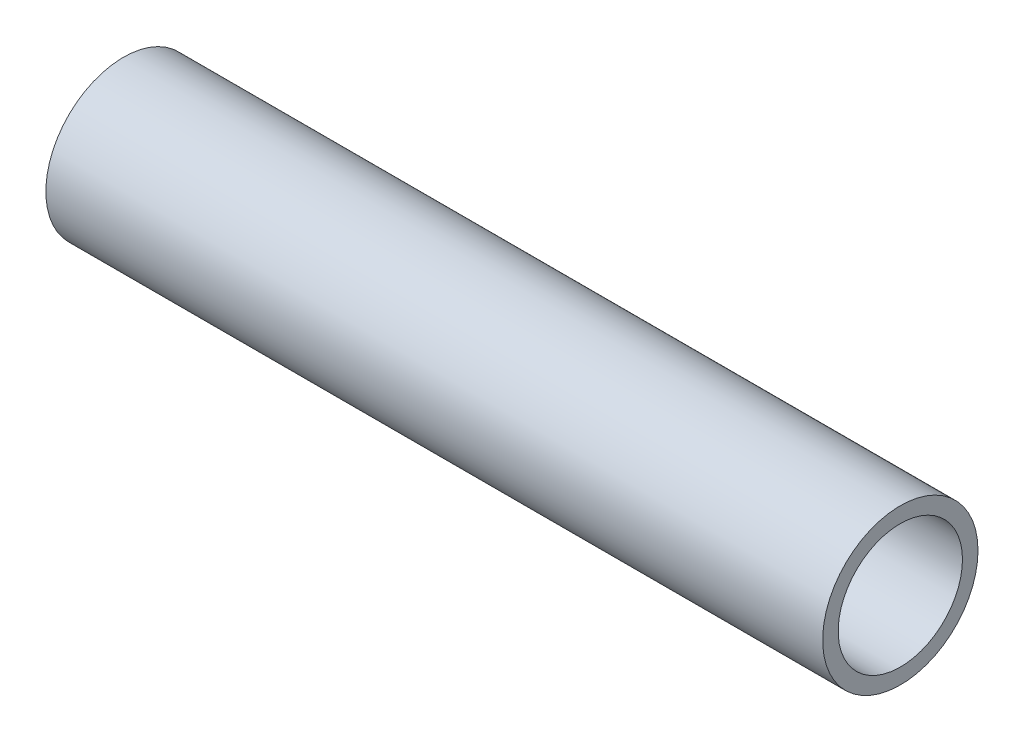
ISO-10303-21;
HEADER;
FILE_DESCRIPTION(('STEP AP214'),'2;1');
FILE_NAME('part.step','',(''),(''),'','','');
FILE_SCHEMA(('AUTOMOTIVE_DESIGN { 1 0 10303 214 1 1 1 1 }'));
ENDSEC;
DATA;
#1=APPLICATION_CONTEXT('core data for automotive mechanical design processes');
#2=APPLICATION_PROTOCOL_DEFINITION('international standard','automotive_design',2000,#1);
#3=PRODUCT_CONTEXT('',#1,'mechanical');
#4=PRODUCT('Part','Part','',(#3));
#5=PRODUCT_RELATED_PRODUCT_CATEGORY('part','',(#4));
#6=PRODUCT_DEFINITION_FORMATION('','',#4);
#7=PRODUCT_DEFINITION_CONTEXT('part definition',#1,'design');
#8=PRODUCT_DEFINITION('design','',#6,#7);
#9=PRODUCT_DEFINITION_SHAPE('','',#8);
#10=(LENGTH_UNIT() NAMED_UNIT(*) SI_UNIT(.MILLI.,.METRE.));
#11=(NAMED_UNIT(*) PLANE_ANGLE_UNIT() SI_UNIT($,.RADIAN.));
#12=(NAMED_UNIT(*) SI_UNIT($,.STERADIAN.) SOLID_ANGLE_UNIT());
#13=UNCERTAINTY_MEASURE_WITH_UNIT(LENGTH_MEASURE(1.E-05),#10,'distance_accuracy_value','');
#14=(GEOMETRIC_REPRESENTATION_CONTEXT(3) GLOBAL_UNCERTAINTY_ASSIGNED_CONTEXT((#13)) GLOBAL_UNIT_ASSIGNED_CONTEXT((#10,
#11,#12)) REPRESENTATION_CONTEXT('',''));
#15=CARTESIAN_POINT('',(0.,0.,0.));
#16=DIRECTION('',(0.,0.,1.));
#17=DIRECTION('',(1.,0.,0.));
#18=AXIS2_PLACEMENT_3D('',#15,#16,#17);
#19=CARTESIAN_POINT('',(25.,0.,0.));
#20=DIRECTION('',(1.,0.,0.));
#21=DIRECTION('',(0.,0.,-1.));
#22=AXIS2_PLACEMENT_3D('',#19,#20,#21);
#23=PLANE('',#22);
#24=CARTESIAN_POINT('',(25.,0.,0.));
#25=DIRECTION('',(1.,0.,0.));
#26=DIRECTION('',(0.,0.,-1.));
#27=AXIS2_PLACEMENT_3D('',#24,#25,#26);
#28=CIRCLE('',#27,5.);
#29=CARTESIAN_POINT('',(25.,0.,-5.));
#30=VERTEX_POINT('',#29);
#31=EDGE_CURVE('E10',#30,#30,#28,.T.);
#32=ORIENTED_EDGE('',*,*,#31,.T.);
#33=EDGE_LOOP('',(#32));
#34=FACE_BOUND('',#33,.T.);
#35=CARTESIAN_POINT('',(25.,0.,0.));
#36=DIRECTION('',(1.,0.,0.));
#37=DIRECTION('',(0.,0.,-1.));
#38=AXIS2_PLACEMENT_3D('',#35,#36,#37);
#39=CIRCLE('',#38,4.);
#40=CARTESIAN_POINT('',(25.,0.,-4.));
#41=VERTEX_POINT('',#40);
#42=EDGE_CURVE('E44',#41,#41,#39,.T.);
#43=ORIENTED_EDGE('',*,*,#42,.F.);
#44=EDGE_LOOP('',(#43));
#45=FACE_BOUND('',#44,.T.);
#46=ADVANCED_FACE('F33',(#34,#45),#23,.T.);
#47=CARTESIAN_POINT('',(-25.,0.,0.));
#48=DIRECTION('',(1.,0.,0.));
#49=DIRECTION('',(0.,0.,-1.));
#50=AXIS2_PLACEMENT_3D('',#47,#48,#49);
#51=PLANE('',#50);
#52=CARTESIAN_POINT('',(-25.,0.,0.));
#53=DIRECTION('',(1.,0.,0.));
#54=DIRECTION('',(0.,0.,-1.));
#55=AXIS2_PLACEMENT_3D('',#52,#53,#54);
#56=CIRCLE('',#55,5.);
#57=CARTESIAN_POINT('',(-25.,0.,-5.));
#58=VERTEX_POINT('',#57);
#59=EDGE_CURVE('E37',#58,#58,#56,.T.);
#60=ORIENTED_EDGE('',*,*,#59,.F.);
#61=EDGE_LOOP('',(#60));
#62=FACE_BOUND('',#61,.T.);
#63=CARTESIAN_POINT('',(-25.,0.,0.));
#64=DIRECTION('',(1.,0.,0.));
#65=DIRECTION('',(0.,0.,-1.));
#66=AXIS2_PLACEMENT_3D('',#63,#64,#65);
#67=CIRCLE('',#66,4.);
#68=CARTESIAN_POINT('',(-25.,0.,-4.));
#69=VERTEX_POINT('',#68);
#70=EDGE_CURVE('E46',#69,#69,#67,.T.);
#71=ORIENTED_EDGE('',*,*,#70,.T.);
#72=EDGE_LOOP('',(#71));
#73=FACE_BOUND('',#72,.T.);
#74=ADVANCED_FACE('F56',(#62,#73),#51,.F.);
#75=CARTESIAN_POINT('',(25.,0.,0.));
#76=DIRECTION('',(-1.,0.,0.));
#77=DIRECTION('',(0.,0.,1.));
#78=AXIS2_PLACEMENT_3D('',#75,#76,#77);
#79=CYLINDRICAL_SURFACE('',#78,5.);
#80=ORIENTED_EDGE('',*,*,#31,.F.);
#81=EDGE_LOOP('',(#80));
#82=FACE_BOUND('',#81,.T.);
#83=ORIENTED_EDGE('',*,*,#59,.T.);
#84=EDGE_LOOP('',(#83));
#85=FACE_BOUND('',#84,.T.);
#86=ADVANCED_FACE('F35',(#82,#85),#79,.T.);
#87=CARTESIAN_POINT('',(25.,0.,0.));
#88=DIRECTION('',(-1.,0.,0.));
#89=DIRECTION('',(0.,0.,1.));
#90=AXIS2_PLACEMENT_3D('',#87,#88,#89);
#91=CYLINDRICAL_SURFACE('',#90,4.);
#92=ORIENTED_EDGE('',*,*,#42,.T.);
#93=EDGE_LOOP('',(#92));
#94=FACE_BOUND('',#93,.T.);
#95=ORIENTED_EDGE('',*,*,#70,.F.);
#96=EDGE_LOOP('',(#95));
#97=FACE_BOUND('',#96,.T.);
#98=ADVANCED_FACE('F52',(#94,#97),#91,.F.);
#99=CLOSED_SHELL('',(#46,#74,#86,#98));
#100=MANIFOLD_SOLID_BREP('B2',#99);
#101=ADVANCED_BREP_SHAPE_REPRESENTATION('',(#18,#100),#14);
#102=SHAPE_DEFINITION_REPRESENTATION(#9,#101);
ENDSEC;
END-ISO-10303-21;
